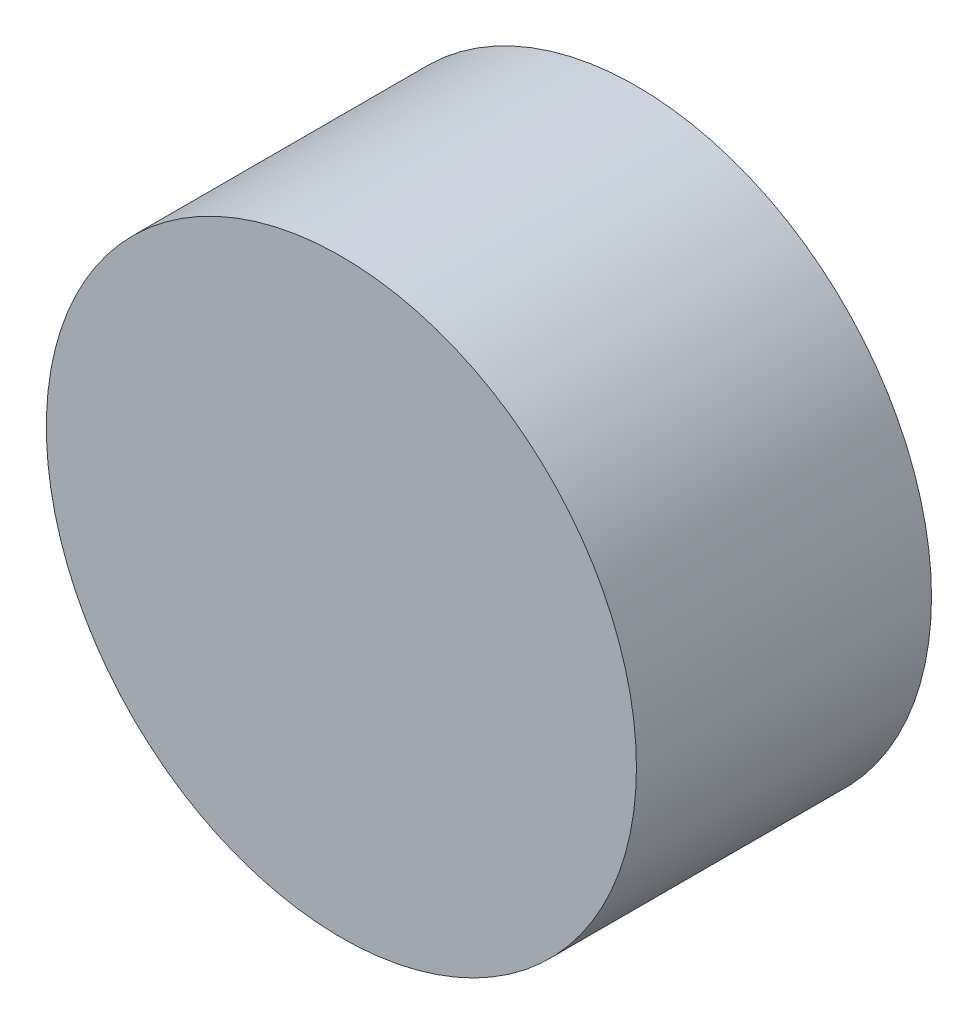
ISO-10303-21;
HEADER;
FILE_DESCRIPTION(('STEP AP214'),'2;1');
FILE_NAME('part.step','',(''),(''),'','','');
FILE_SCHEMA(('AUTOMOTIVE_DESIGN { 1 0 10303 214 1 1 1 1 }'));
ENDSEC;
DATA;
#1=APPLICATION_CONTEXT('core data for automotive mechanical design processes');
#2=APPLICATION_PROTOCOL_DEFINITION('international standard','automotive_design',2000,#1);
#3=PRODUCT_CONTEXT('',#1,'mechanical');
#4=PRODUCT('Part','Part','',(#3));
#5=PRODUCT_RELATED_PRODUCT_CATEGORY('part','',(#4));
#6=PRODUCT_DEFINITION_FORMATION('','',#4);
#7=PRODUCT_DEFINITION_CONTEXT('part definition',#1,'design');
#8=PRODUCT_DEFINITION('design','',#6,#7);
#9=PRODUCT_DEFINITION_SHAPE('','',#8);
#10=(LENGTH_UNIT() NAMED_UNIT(*) SI_UNIT(.MILLI.,.METRE.));
#11=(NAMED_UNIT(*) PLANE_ANGLE_UNIT() SI_UNIT($,.RADIAN.));
#12=(NAMED_UNIT(*) SI_UNIT($,.STERADIAN.) SOLID_ANGLE_UNIT());
#13=UNCERTAINTY_MEASURE_WITH_UNIT(LENGTH_MEASURE(1.E-05),#10,'distance_accuracy_value','');
#14=(GEOMETRIC_REPRESENTATION_CONTEXT(3) GLOBAL_UNCERTAINTY_ASSIGNED_CONTEXT((#13)) GLOBAL_UNIT_ASSIGNED_CONTEXT((#10,
#11,#12)) REPRESENTATION_CONTEXT('',''));
#15=CARTESIAN_POINT('',(0.,0.,0.));
#16=DIRECTION('',(0.,0.,1.));
#17=DIRECTION('',(1.,0.,0.));
#18=AXIS2_PLACEMENT_3D('',#15,#16,#17);
#19=CARTESIAN_POINT('',(0.,0.,0.5));
#20=DIRECTION('',(0.,0.,-1.));
#21=DIRECTION('',(-1.,0.,0.));
#22=AXIS2_PLACEMENT_3D('',#19,#20,#21);
#23=CYLINDRICAL_SURFACE('',#22,1.);
#24=CARTESIAN_POINT('',(0.,0.,0.5));
#25=DIRECTION('',(0.,0.,1.));
#26=DIRECTION('',(1.,0.,0.));
#27=AXIS2_PLACEMENT_3D('',#24,#25,#26);
#28=CIRCLE('',#27,1.);
#29=CARTESIAN_POINT('',(1.,0.,0.5));
#30=VERTEX_POINT('',#29);
#31=EDGE_CURVE('E10',#30,#30,#28,.T.);
#32=ORIENTED_EDGE('',*,*,#31,.F.);
#33=EDGE_LOOP('',(#32));
#34=FACE_BOUND('',#33,.T.);
#35=CARTESIAN_POINT('',(0.,0.,-0.5));
#36=DIRECTION('',(0.,0.,1.));
#37=DIRECTION('',(1.,0.,0.));
#38=AXIS2_PLACEMENT_3D('',#35,#36,#37);
#39=CIRCLE('',#38,1.);
#40=CARTESIAN_POINT('',(1.,0.,-0.5));
#41=VERTEX_POINT('',#40);
#42=EDGE_CURVE('E36',#41,#41,#39,.T.);
#43=ORIENTED_EDGE('',*,*,#42,.T.);
#44=EDGE_LOOP('',(#43));
#45=FACE_BOUND('',#44,.T.);
#46=ADVANCED_FACE('F33',(#34,#45),#23,.T.);
#47=CARTESIAN_POINT('',(0.,0.,0.5));
#48=DIRECTION('',(0.,0.,1.));
#49=DIRECTION('',(1.,0.,0.));
#50=AXIS2_PLACEMENT_3D('',#47,#48,#49);
#51=PLANE('',#50);
#52=ORIENTED_EDGE('',*,*,#31,.T.);
#53=EDGE_LOOP('',(#52));
#54=FACE_BOUND('',#53,.T.);
#55=ADVANCED_FACE('F48',(#54),#51,.T.);
#56=CARTESIAN_POINT('',(0.,0.,-0.5));
#57=DIRECTION('',(0.,0.,1.));
#58=DIRECTION('',(1.,0.,0.));
#59=AXIS2_PLACEMENT_3D('',#56,#57,#58);
#60=PLANE('',#59);
#61=ORIENTED_EDGE('',*,*,#42,.F.);
#62=EDGE_LOOP('',(#61));
#63=FACE_BOUND('',#62,.T.);
#64=ADVANCED_FACE('F46',(#63),#60,.F.);
#65=CLOSED_SHELL('',(#46,#55,#64));
#66=MANIFOLD_SOLID_BREP('B2',#65);
#67=ADVANCED_BREP_SHAPE_REPRESENTATION('',(#18,#66),#14);
#68=SHAPE_DEFINITION_REPRESENTATION(#9,#67);
ENDSEC;
END-ISO-10303-21;
